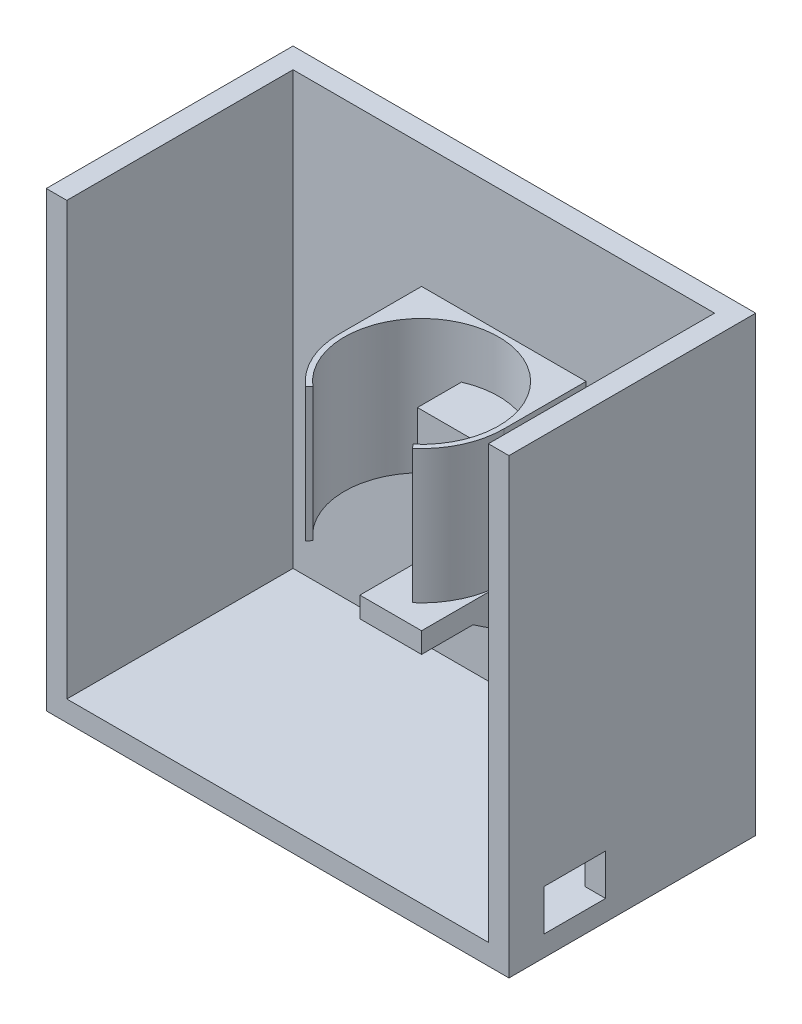
ISO-10303-21;
HEADER;
FILE_DESCRIPTION(('STEP AP214'),'2;1');
FILE_NAME('part.step','',(''),(''),'','','');
FILE_SCHEMA(('AUTOMOTIVE_DESIGN { 1 0 10303 214 1 1 1 1 }'));
ENDSEC;
DATA;
#1=APPLICATION_CONTEXT('core data for automotive mechanical design processes');
#2=APPLICATION_PROTOCOL_DEFINITION('international standard','automotive_design',2000,#1);
#3=PRODUCT_CONTEXT('',#1,'mechanical');
#4=PRODUCT('Part','Part','',(#3));
#5=PRODUCT_RELATED_PRODUCT_CATEGORY('part','',(#4));
#6=PRODUCT_DEFINITION_FORMATION('','',#4);
#7=PRODUCT_DEFINITION_CONTEXT('part definition',#1,'design');
#8=PRODUCT_DEFINITION('design','',#6,#7);
#9=PRODUCT_DEFINITION_SHAPE('','',#8);
#10=(LENGTH_UNIT() NAMED_UNIT(*) SI_UNIT(.MILLI.,.METRE.));
#11=(NAMED_UNIT(*) PLANE_ANGLE_UNIT() SI_UNIT($,.RADIAN.));
#12=(NAMED_UNIT(*) SI_UNIT($,.STERADIAN.) SOLID_ANGLE_UNIT());
#13=UNCERTAINTY_MEASURE_WITH_UNIT(LENGTH_MEASURE(1.E-05),#10,'distance_accuracy_value','');
#14=(GEOMETRIC_REPRESENTATION_CONTEXT(3) GLOBAL_UNCERTAINTY_ASSIGNED_CONTEXT((#13)) GLOBAL_UNIT_ASSIGNED_CONTEXT((#10,
#11,#12)) REPRESENTATION_CONTEXT('',''));
#15=CARTESIAN_POINT('',(0.,0.,0.));
#16=DIRECTION('',(0.,0.,1.));
#17=DIRECTION('',(1.,0.,0.));
#18=AXIS2_PLACEMENT_3D('',#15,#16,#17);
#19=CARTESIAN_POINT('',(0.,95.,50.));
#20=DIRECTION('',(0.,1.,0.));
#21=DIRECTION('',(0.,0.,1.));
#22=AXIS2_PLACEMENT_3D('',#19,#20,#21);
#23=CYLINDRICAL_SURFACE('',#22,37.5);
#24=CARTESIAN_POINT('',(0.,95.,50.));
#25=DIRECTION('',(0.,-1.,0.));
#26=DIRECTION('',(0.,0.,1.));
#27=AXIS2_PLACEMENT_3D('',#24,#25,#26);
#28=CIRCLE('',#27,37.5);
#29=CARTESIAN_POINT('',(-24.375,95.,78.497532787945));
#30=VERTEX_POINT('',#29);
#31=CARTESIAN_POINT('',(-15.,95.,15.6306822878312));
#32=VERTEX_POINT('',#31);
#33=EDGE_CURVE('E328',#30,#32,#28,.T.);
#34=ORIENTED_EDGE('',*,*,#33,.T.);
#35=DIRECTION('',(0.,-1.,0.));
#36=VECTOR('',#35,1.);
#37=CARTESIAN_POINT('',(-15.,135.,15.6306822878312));
#38=LINE('',#37,#36);
#39=CARTESIAN_POINT('',(-15.,135.,15.6306822878312));
#40=VERTEX_POINT('',#39);
#41=EDGE_CURVE('E324',#40,#32,#38,.T.);
#42=ORIENTED_EDGE('',*,*,#41,.F.);
#43=CARTESIAN_POINT('',(0.,135.,50.));
#44=DIRECTION('',(0.,1.,0.));
#45=DIRECTION('',(0.,0.,-1.));
#46=AXIS2_PLACEMENT_3D('',#43,#44,#45);
#47=CIRCLE('',#46,37.5);
#48=CARTESIAN_POINT('',(35.1745646739231,135.,37.));
#49=VERTEX_POINT('',#48);
#50=EDGE_CURVE('E306',#49,#40,#47,.T.);
#51=ORIENTED_EDGE('',*,*,#50,.F.);
#52=DIRECTION('',(0.,-1.,0.));
#53=VECTOR('',#52,1.);
#54=CARTESIAN_POINT('',(35.1745646739231,135.,37.));
#55=LINE('',#54,#53);
#56=CARTESIAN_POINT('',(35.1745646739231,95.,37.));
#57=VERTEX_POINT('',#56);
#58=EDGE_CURVE('E315',#49,#57,#55,.T.);
#59=ORIENTED_EDGE('',*,*,#58,.T.);
#60=CARTESIAN_POINT('',(24.375,95.,78.497532787945));
#61=VERTEX_POINT('',#60);
#62=EDGE_CURVE('E331',#57,#61,#28,.T.);
#63=ORIENTED_EDGE('',*,*,#62,.T.);
#64=DIRECTION('',(0.,1.,0.));
#65=VECTOR('',#64,1.);
#66=CARTESIAN_POINT('',(24.375,95.,78.497532787945));
#67=LINE('',#66,#65);
#68=CARTESIAN_POINT('',(24.375,160.,78.497532787945));
#69=VERTEX_POINT('',#68);
#70=EDGE_CURVE('E352',#61,#69,#67,.T.);
#71=ORIENTED_EDGE('',*,*,#70,.T.);
#72=CARTESIAN_POINT('',(0.,160.,50.));
#73=DIRECTION('',(0.,-1.,0.));
#74=DIRECTION('',(0.,0.,1.));
#75=AXIS2_PLACEMENT_3D('',#72,#73,#74);
#76=CIRCLE('',#75,37.5);
#77=CARTESIAN_POINT('',(-24.375,160.,78.497532787945));
#78=VERTEX_POINT('',#77);
#79=EDGE_CURVE('E327',#78,#69,#76,.T.);
#80=ORIENTED_EDGE('',*,*,#79,.F.);
#81=DIRECTION('',(0.,1.,0.));
#82=VECTOR('',#81,1.);
#83=CARTESIAN_POINT('',(-24.375,95.,78.497532787945));
#84=LINE('',#83,#82);
#85=EDGE_CURVE('E375',#30,#78,#84,.T.);
#86=ORIENTED_EDGE('',*,*,#85,.F.);
#87=EDGE_LOOP('',(#34,#42,#51,#59,#63,#71,#80,#86));
#88=FACE_BOUND('',#87,.T.);
#89=ADVANCED_FACE('F33',(#88),#23,.F.);
#90=CARTESIAN_POINT('',(0.,0.,9.99999999999999));
#91=DIRECTION('',(0.,0.,-1.));
#92=DIRECTION('',(-1.,0.,0.));
#93=AXIS2_PLACEMENT_3D('',#90,#91,#92);
#94=PLANE('',#93);
#95=DIRECTION('',(1.,0.,0.));
#96=VECTOR('',#95,1.);
#97=CARTESIAN_POINT('',(83.5,21.5,9.99999999999999));
#98=LINE('',#97,#96);
#99=CARTESIAN_POINT('',(61.5,21.5,9.99999999999999));
#100=VERTEX_POINT('',#99);
#101=CARTESIAN_POINT('',(83.5,21.5,9.99999999999999));
#102=VERTEX_POINT('',#101);
#103=EDGE_CURVE('E261',#100,#102,#98,.T.);
#104=ORIENTED_EDGE('',*,*,#103,.F.);
#105=DIRECTION('',(0.,-1.,0.));
#106=VECTOR('',#105,1.);
#107=CARTESIAN_POINT('',(61.5,21.5,9.99999999999999));
#108=LINE('',#107,#106);
#109=CARTESIAN_POINT('',(61.5,38.5,9.99999999999999));
#110=VERTEX_POINT('',#109);
#111=EDGE_CURVE('E243',#110,#100,#108,.T.);
#112=ORIENTED_EDGE('',*,*,#111,.F.);
#113=DIRECTION('',(-1.,0.,0.));
#114=VECTOR('',#113,1.);
#115=CARTESIAN_POINT('',(83.5,38.5,9.99999999999999));
#116=LINE('',#115,#114);
#117=CARTESIAN_POINT('',(83.5,38.5,9.99999999999999));
#118=VERTEX_POINT('',#117);
#119=EDGE_CURVE('E252',#118,#110,#116,.T.);
#120=ORIENTED_EDGE('',*,*,#119,.F.);
#121=DIRECTION('',(0.,1.,0.));
#122=VECTOR('',#121,1.);
#123=CARTESIAN_POINT('',(83.5,21.5,9.99999999999999));
#124=LINE('',#123,#122);
#125=EDGE_CURVE('E48',#102,#118,#124,.T.);
#126=ORIENTED_EDGE('',*,*,#125,.F.);
#127=EDGE_LOOP('',(#104,#112,#120,#126));
#128=FACE_BOUND('',#127,.T.);
#129=DIRECTION('',(-1.,0.,0.));
#130=VECTOR('',#129,1.);
#131=CARTESIAN_POINT('',(-102.5,220.,9.99999999999999));
#132=LINE('',#131,#130);
#133=CARTESIAN_POINT('',(102.5,220.,9.99999999999999));
#134=VERTEX_POINT('',#133);
#135=CARTESIAN_POINT('',(-102.5,220.,9.99999999999999));
#136=VERTEX_POINT('',#135);
#137=EDGE_CURVE('E431',#134,#136,#132,.T.);
#138=ORIENTED_EDGE('',*,*,#137,.T.);
#139=DIRECTION('',(0.,-1.,0.));
#140=VECTOR('',#139,1.);
#141=CARTESIAN_POINT('',(-102.5,10.,9.99999999999999));
#142=LINE('',#141,#140);
#143=CARTESIAN_POINT('',(-102.5,10.,9.99999999999999));
#144=VERTEX_POINT('',#143);
#145=EDGE_CURVE('E434',#136,#144,#142,.T.);
#146=ORIENTED_EDGE('',*,*,#145,.T.);
#147=DIRECTION('',(1.,0.,0.));
#148=VECTOR('',#147,1.);
#149=CARTESIAN_POINT('',(-102.5,10.,9.99999999999999));
#150=LINE('',#149,#148);
#151=CARTESIAN_POINT('',(102.5,10.,9.99999999999999));
#152=VERTEX_POINT('',#151);
#153=EDGE_CURVE('E437',#144,#152,#150,.T.);
#154=ORIENTED_EDGE('',*,*,#153,.T.);
#155=DIRECTION('',(0.,1.,0.));
#156=VECTOR('',#155,1.);
#157=CARTESIAN_POINT('',(102.5,10.,9.99999999999999));
#158=LINE('',#157,#156);
#159=EDGE_CURVE('E428',#152,#134,#158,.T.);
#160=ORIENTED_EDGE('',*,*,#159,.T.);
#161=EDGE_LOOP('',(#138,#146,#154,#160));
#162=FACE_BOUND('',#161,.T.);
#163=DIRECTION('',(-1.,0.,0.));
#164=VECTOR('',#163,1.);
#165=CARTESIAN_POINT('',(-15.,70.,9.99999999999999));
#166=LINE('',#165,#164);
#167=CARTESIAN_POINT('',(15.,70.,9.99999999999999));
#168=VERTEX_POINT('',#167);
#169=CARTESIAN_POINT('',(-15.,70.,9.99999999999999));
#170=VERTEX_POINT('',#169);
#171=EDGE_CURVE('E415',#168,#170,#166,.T.);
#172=ORIENTED_EDGE('',*,*,#171,.F.);
#173=DIRECTION('',(0.,1.,0.));
#174=VECTOR('',#173,1.);
#175=CARTESIAN_POINT('',(15.,60.,9.99999999999999));
#176=LINE('',#175,#174);
#177=CARTESIAN_POINT('',(15.,40.,9.99999999999999));
#178=VERTEX_POINT('',#177);
#179=EDGE_CURVE('E401',#178,#168,#176,.T.);
#180=ORIENTED_EDGE('',*,*,#179,.F.);
#181=DIRECTION('',(-1.,0.,0.));
#182=VECTOR('',#181,1.);
#183=CARTESIAN_POINT('',(0.,40.,9.99999999999999));
#184=LINE('',#183,#182);
#185=CARTESIAN_POINT('',(-15.,40.,9.99999999999999));
#186=VERTEX_POINT('',#185);
#187=EDGE_CURVE('E396',#178,#186,#184,.T.);
#188=ORIENTED_EDGE('',*,*,#187,.T.);
#189=DIRECTION('',(0.,-1.,0.));
#190=VECTOR('',#189,1.);
#191=CARTESIAN_POINT('',(-15.,60.,9.99999999999999));
#192=LINE('',#191,#190);
#193=EDGE_CURVE('E406',#170,#186,#192,.T.);
#194=ORIENTED_EDGE('',*,*,#193,.F.);
#195=EDGE_LOOP('',(#172,#180,#188,#194));
#196=FACE_BOUND('',#195,.T.);
#197=DIRECTION('',(-1.,0.,0.));
#198=VECTOR('',#197,1.);
#199=CARTESIAN_POINT('',(0.,95.,9.99999999999999));
#200=LINE('',#199,#198);
#201=CARTESIAN_POINT('',(40.,95.,9.99999999999999));
#202=VERTEX_POINT('',#201);
#203=CARTESIAN_POINT('',(-40.,95.,9.99999999999999));
#204=VERTEX_POINT('',#203);
#205=EDGE_CURVE('E340',#202,#204,#200,.T.);
#206=ORIENTED_EDGE('',*,*,#205,.T.);
#207=DIRECTION('',(0.,1.,0.));
#208=VECTOR('',#207,1.);
#209=CARTESIAN_POINT('',(-40.,95.,9.99999999999999));
#210=LINE('',#209,#208);
#211=CARTESIAN_POINT('',(-40.,160.,9.99999999999999));
#212=VERTEX_POINT('',#211);
#213=EDGE_CURVE('E382',#204,#212,#210,.T.);
#214=ORIENTED_EDGE('',*,*,#213,.T.);
#215=DIRECTION('',(-1.,0.,0.));
#216=VECTOR('',#215,1.);
#217=CARTESIAN_POINT('',(-40.,160.,9.99999999999999));
#218=LINE('',#217,#216);
#219=CARTESIAN_POINT('',(40.,160.,9.99999999999999));
#220=VERTEX_POINT('',#219);
#221=EDGE_CURVE('E363',#220,#212,#218,.T.);
#222=ORIENTED_EDGE('',*,*,#221,.F.);
#223=DIRECTION('',(0.,1.,0.));
#224=VECTOR('',#223,1.);
#225=CARTESIAN_POINT('',(40.,95.,9.99999999999999));
#226=LINE('',#225,#224);
#227=EDGE_CURVE('E385',#202,#220,#226,.T.);
#228=ORIENTED_EDGE('',*,*,#227,.F.);
#229=EDGE_LOOP('',(#206,#214,#222,#228));
#230=FACE_BOUND('',#229,.T.);
#231=ADVANCED_FACE('F258',(#128,#162,#196,#230),#94,.F.);
#232=CARTESIAN_POINT('',(112.5,0.,120.));
#233=DIRECTION('',(-1.,0.,0.));
#234=DIRECTION('',(0.,-1.,0.));
#235=AXIS2_PLACEMENT_3D('',#232,#233,#234);
#236=PLANE('',#235);
#237=DIRECTION('',(0.,0.,-1.));
#238=VECTOR('',#237,1.);
#239=CARTESIAN_POINT('',(112.5,10.,73.));
#240=LINE('',#239,#238);
#241=CARTESIAN_POINT('',(112.5,10.,103.));
#242=VERTEX_POINT('',#241);
#243=CARTESIAN_POINT('',(112.5,10.,73.));
#244=VERTEX_POINT('',#243);
#245=EDGE_CURVE('E279',#242,#244,#240,.T.);
#246=ORIENTED_EDGE('',*,*,#245,.F.);
#247=DIRECTION('',(0.,-1.,0.));
#248=VECTOR('',#247,1.);
#249=CARTESIAN_POINT('',(112.5,10.,103.));
#250=LINE('',#249,#248);
#251=CARTESIAN_POINT('',(112.5,30.,103.));
#252=VERTEX_POINT('',#251);
#253=EDGE_CURVE('E282',#252,#242,#250,.T.);
#254=ORIENTED_EDGE('',*,*,#253,.F.);
#255=DIRECTION('',(0.,0.,1.));
#256=VECTOR('',#255,1.);
#257=CARTESIAN_POINT('',(112.5,30.,73.));
#258=LINE('',#257,#256);
#259=CARTESIAN_POINT('',(112.5,30.,73.));
#260=VERTEX_POINT('',#259);
#261=EDGE_CURVE('E296',#260,#252,#258,.T.);
#262=ORIENTED_EDGE('',*,*,#261,.F.);
#263=DIRECTION('',(0.,1.,0.));
#264=VECTOR('',#263,1.);
#265=CARTESIAN_POINT('',(112.5,10.,73.));
#266=LINE('',#265,#264);
#267=EDGE_CURVE('E255',#244,#260,#266,.T.);
#268=ORIENTED_EDGE('',*,*,#267,.F.);
#269=EDGE_LOOP('',(#246,#254,#262,#268));
#270=FACE_BOUND('',#269,.T.);
#271=DIRECTION('',(0.,1.,0.));
#272=VECTOR('',#271,1.);
#273=CARTESIAN_POINT('',(112.5,0.,0.));
#274=LINE('',#273,#272);
#275=CARTESIAN_POINT('',(112.5,0.,0.));
#276=VERTEX_POINT('',#275);
#277=CARTESIAN_POINT('',(112.5,220.,0.));
#278=VERTEX_POINT('',#277);
#279=EDGE_CURVE('E450',#276,#278,#274,.T.);
#280=ORIENTED_EDGE('',*,*,#279,.T.);
#281=DIRECTION('',(0.,0.,-1.));
#282=VECTOR('',#281,1.);
#283=CARTESIAN_POINT('',(112.5,220.,120.));
#284=LINE('',#283,#282);
#285=CARTESIAN_POINT('',(112.5,220.,120.));
#286=VERTEX_POINT('',#285);
#287=EDGE_CURVE('E41',#286,#278,#284,.T.);
#288=ORIENTED_EDGE('',*,*,#287,.F.);
#289=DIRECTION('',(0.,1.,0.));
#290=VECTOR('',#289,1.);
#291=CARTESIAN_POINT('',(112.5,0.,120.));
#292=LINE('',#291,#290);
#293=CARTESIAN_POINT('',(112.5,0.,120.));
#294=VERTEX_POINT('',#293);
#295=EDGE_CURVE('E458',#294,#286,#292,.T.);
#296=ORIENTED_EDGE('',*,*,#295,.F.);
#297=DIRECTION('',(0.,0.,-1.));
#298=VECTOR('',#297,1.);
#299=CARTESIAN_POINT('',(112.5,0.,120.));
#300=LINE('',#299,#298);
#301=EDGE_CURVE('E470',#294,#276,#300,.T.);
#302=ORIENTED_EDGE('',*,*,#301,.T.);
#303=EDGE_LOOP('',(#280,#288,#296,#302));
#304=FACE_BOUND('',#303,.T.);
#305=ADVANCED_FACE('F35',(#270,#304),#236,.F.);
#306=CARTESIAN_POINT('',(-112.5,220.,120.));
#307=DIRECTION('',(0.,-1.,0.));
#308=DIRECTION('',(0.,0.,-1.));
#309=AXIS2_PLACEMENT_3D('',#306,#307,#308);
#310=PLANE('',#309);
#311=DIRECTION('',(-1.,0.,0.));
#312=VECTOR('',#311,1.);
#313=CARTESIAN_POINT('',(-112.5,220.,0.));
#314=LINE('',#313,#312);
#315=CARTESIAN_POINT('',(-112.5,220.,0.));
#316=VERTEX_POINT('',#315);
#317=EDGE_CURVE('E473',#278,#316,#314,.T.);
#318=ORIENTED_EDGE('',*,*,#317,.T.);
#319=DIRECTION('',(0.,0.,-1.));
#320=VECTOR('',#319,1.);
#321=CARTESIAN_POINT('',(-112.5,220.,120.));
#322=LINE('',#321,#320);
#323=CARTESIAN_POINT('',(-112.5,220.,120.));
#324=VERTEX_POINT('',#323);
#325=EDGE_CURVE('E483',#324,#316,#322,.T.);
#326=ORIENTED_EDGE('',*,*,#325,.F.);
#327=DIRECTION('',(-1.,0.,0.));
#328=VECTOR('',#327,1.);
#329=CARTESIAN_POINT('',(-112.5,220.,120.));
#330=LINE('',#329,#328);
#331=CARTESIAN_POINT('',(-102.5,220.,120.));
#332=VERTEX_POINT('',#331);
#333=EDGE_CURVE('E461',#332,#324,#330,.T.);
#334=ORIENTED_EDGE('',*,*,#333,.F.);
#335=DIRECTION('',(0.,0.,1.));
#336=VECTOR('',#335,1.);
#337=CARTESIAN_POINT('',(-102.5,220.,9.99999999999999));
#338=LINE('',#337,#336);
#339=EDGE_CURVE('E454',#136,#332,#338,.T.);
#340=ORIENTED_EDGE('',*,*,#339,.F.);
#341=ORIENTED_EDGE('',*,*,#137,.F.);
#342=DIRECTION('',(0.,0.,1.));
#343=VECTOR('',#342,1.);
#344=CARTESIAN_POINT('',(102.5,220.,9.99999999999999));
#345=LINE('',#344,#343);
#346=CARTESIAN_POINT('',(102.5,220.,120.));
#347=VERTEX_POINT('',#346);
#348=EDGE_CURVE('E440',#134,#347,#345,.T.);
#349=ORIENTED_EDGE('',*,*,#348,.T.);
#350=EDGE_CURVE('E463',#286,#347,#330,.T.);
#351=ORIENTED_EDGE('',*,*,#350,.F.);
#352=ORIENTED_EDGE('',*,*,#287,.T.);
#353=EDGE_LOOP('',(#318,#326,#334,#340,#341,#349,#351,#352));
#354=FACE_BOUND('',#353,.T.);
#355=ADVANCED_FACE('F488',(#354),#310,.F.);
#356=CARTESIAN_POINT('',(-112.5,0.,120.));
#357=DIRECTION('',(1.,0.,0.));
#358=DIRECTION('',(0.,1.,0.));
#359=AXIS2_PLACEMENT_3D('',#356,#357,#358);
#360=PLANE('',#359);
#361=DIRECTION('',(0.,-1.,0.));
#362=VECTOR('',#361,1.);
#363=CARTESIAN_POINT('',(-112.5,0.,0.));
#364=LINE('',#363,#362);
#365=CARTESIAN_POINT('',(-112.5,0.,0.));
#366=VERTEX_POINT('',#365);
#367=EDGE_CURVE('E475',#316,#366,#364,.T.);
#368=ORIENTED_EDGE('',*,*,#367,.T.);
#369=DIRECTION('',(0.,0.,-1.));
#370=VECTOR('',#369,1.);
#371=CARTESIAN_POINT('',(-112.5,0.,120.));
#372=LINE('',#371,#370);
#373=CARTESIAN_POINT('',(-112.5,0.,120.));
#374=VERTEX_POINT('',#373);
#375=EDGE_CURVE('E480',#374,#366,#372,.T.);
#376=ORIENTED_EDGE('',*,*,#375,.F.);
#377=DIRECTION('',(0.,-1.,0.));
#378=VECTOR('',#377,1.);
#379=CARTESIAN_POINT('',(-112.5,0.,120.));
#380=LINE('',#379,#378);
#381=EDGE_CURVE('E466',#324,#374,#380,.T.);
#382=ORIENTED_EDGE('',*,*,#381,.F.);
#383=ORIENTED_EDGE('',*,*,#325,.T.);
#384=EDGE_LOOP('',(#368,#376,#382,#383));
#385=FACE_BOUND('',#384,.T.);
#386=ADVANCED_FACE('F500',(#385),#360,.F.);
#387=CARTESIAN_POINT('',(-112.5,0.,120.));
#388=DIRECTION('',(0.,1.,0.));
#389=DIRECTION('',(0.,0.,1.));
#390=AXIS2_PLACEMENT_3D('',#387,#388,#389);
#391=PLANE('',#390);
#392=DIRECTION('',(1.,0.,0.));
#393=VECTOR('',#392,1.);
#394=CARTESIAN_POINT('',(-112.5,0.,0.));
#395=LINE('',#394,#393);
#396=EDGE_CURVE('E462',#366,#276,#395,.T.);
#397=ORIENTED_EDGE('',*,*,#396,.T.);
#398=ORIENTED_EDGE('',*,*,#301,.F.);
#399=DIRECTION('',(1.,0.,0.));
#400=VECTOR('',#399,1.);
#401=CARTESIAN_POINT('',(-112.5,0.,120.));
#402=LINE('',#401,#400);
#403=EDGE_CURVE('E468',#374,#294,#402,.T.);
#404=ORIENTED_EDGE('',*,*,#403,.F.);
#405=ORIENTED_EDGE('',*,*,#375,.T.);
#406=EDGE_LOOP('',(#397,#398,#404,#405));
#407=FACE_BOUND('',#406,.T.);
#408=ADVANCED_FACE('F504',(#407),#391,.F.);
#409=CARTESIAN_POINT('',(0.,0.,120.));
#410=DIRECTION('',(0.,0.,-1.));
#411=DIRECTION('',(-1.,0.,0.));
#412=AXIS2_PLACEMENT_3D('',#409,#410,#411);
#413=PLANE('',#412);
#414=ORIENTED_EDGE('',*,*,#350,.T.);
#415=DIRECTION('',(0.,1.,0.));
#416=VECTOR('',#415,1.);
#417=CARTESIAN_POINT('',(102.5,10.,120.));
#418=LINE('',#417,#416);
#419=CARTESIAN_POINT('',(102.5,10.,120.));
#420=VERTEX_POINT('',#419);
#421=EDGE_CURVE('E427',#420,#347,#418,.T.);
#422=ORIENTED_EDGE('',*,*,#421,.F.);
#423=DIRECTION('',(1.,0.,0.));
#424=VECTOR('',#423,1.);
#425=CARTESIAN_POINT('',(-102.5,10.,120.));
#426=LINE('',#425,#424);
#427=CARTESIAN_POINT('',(-102.5,10.,120.));
#428=VERTEX_POINT('',#427);
#429=EDGE_CURVE('E432',#428,#420,#426,.T.);
#430=ORIENTED_EDGE('',*,*,#429,.F.);
#431=DIRECTION('',(0.,-1.,0.));
#432=VECTOR('',#431,1.);
#433=CARTESIAN_POINT('',(-102.5,10.,120.));
#434=LINE('',#433,#432);
#435=EDGE_CURVE('E442',#332,#428,#434,.T.);
#436=ORIENTED_EDGE('',*,*,#435,.F.);
#437=ORIENTED_EDGE('',*,*,#333,.T.);
#438=ORIENTED_EDGE('',*,*,#381,.T.);
#439=ORIENTED_EDGE('',*,*,#403,.T.);
#440=ORIENTED_EDGE('',*,*,#295,.T.);
#441=EDGE_LOOP('',(#414,#422,#430,#436,#437,#438,#439,#440));
#442=FACE_BOUND('',#441,.T.);
#443=ADVANCED_FACE('F506',(#442),#413,.F.);
#444=CARTESIAN_POINT('',(0.,0.,0.));
#445=DIRECTION('',(0.,0.,-1.));
#446=DIRECTION('',(-1.,0.,0.));
#447=AXIS2_PLACEMENT_3D('',#444,#445,#446);
#448=PLANE('',#447);
#449=DIRECTION('',(0.,1.,0.));
#450=VECTOR('',#449,1.);
#451=CARTESIAN_POINT('',(61.5,21.5,0.));
#452=LINE('',#451,#450);
#453=CARTESIAN_POINT('',(61.5,21.5,0.));
#454=VERTEX_POINT('',#453);
#455=CARTESIAN_POINT('',(61.5,38.5,0.));
#456=VERTEX_POINT('',#455);
#457=EDGE_CURVE('E56',#454,#456,#452,.T.);
#458=ORIENTED_EDGE('',*,*,#457,.F.);
#459=DIRECTION('',(-1.,0.,0.));
#460=VECTOR('',#459,1.);
#461=CARTESIAN_POINT('',(83.5,21.5,0.));
#462=LINE('',#461,#460);
#463=CARTESIAN_POINT('',(83.5,21.5,0.));
#464=VERTEX_POINT('',#463);
#465=EDGE_CURVE('E249',#464,#454,#462,.T.);
#466=ORIENTED_EDGE('',*,*,#465,.F.);
#467=DIRECTION('',(0.,-1.,0.));
#468=VECTOR('',#467,1.);
#469=CARTESIAN_POINT('',(83.5,21.5,0.));
#470=LINE('',#469,#468);
#471=CARTESIAN_POINT('',(83.5,38.5,0.));
#472=VERTEX_POINT('',#471);
#473=EDGE_CURVE('E269',#472,#464,#470,.T.);
#474=ORIENTED_EDGE('',*,*,#473,.F.);
#475=DIRECTION('',(1.,0.,0.));
#476=VECTOR('',#475,1.);
#477=CARTESIAN_POINT('',(83.5,38.5,0.));
#478=LINE('',#477,#476);
#479=EDGE_CURVE('E263',#456,#472,#478,.T.);
#480=ORIENTED_EDGE('',*,*,#479,.F.);
#481=EDGE_LOOP('',(#458,#466,#474,#480));
#482=FACE_BOUND('',#481,.T.);
#483=ORIENTED_EDGE('',*,*,#367,.F.);
#484=ORIENTED_EDGE('',*,*,#317,.F.);
#485=ORIENTED_EDGE('',*,*,#279,.F.);
#486=ORIENTED_EDGE('',*,*,#396,.F.);
#487=EDGE_LOOP('',(#483,#484,#485,#486));
#488=FACE_BOUND('',#487,.T.);
#489=ADVANCED_FACE('F497',(#482,#488),#448,.T.);
#490=CARTESIAN_POINT('',(102.5,10.,9.99999999999999));
#491=DIRECTION('',(1.,0.,0.));
#492=DIRECTION('',(0.,1.,0.));
#493=AXIS2_PLACEMENT_3D('',#490,#491,#492);
#494=PLANE('',#493);
#495=DIRECTION('',(0.,0.,-1.));
#496=VECTOR('',#495,1.);
#497=CARTESIAN_POINT('',(102.5,30.,73.));
#498=LINE('',#497,#496);
#499=CARTESIAN_POINT('',(102.5,30.,103.));
#500=VERTEX_POINT('',#499);
#501=CARTESIAN_POINT('',(102.5,30.,73.));
#502=VERTEX_POINT('',#501);
#503=EDGE_CURVE('E288',#500,#502,#498,.T.);
#504=ORIENTED_EDGE('',*,*,#503,.F.);
#505=DIRECTION('',(0.,1.,0.));
#506=VECTOR('',#505,1.);
#507=CARTESIAN_POINT('',(102.5,10.,103.));
#508=LINE('',#507,#506);
#509=CARTESIAN_POINT('',(102.5,10.,103.));
#510=VERTEX_POINT('',#509);
#511=EDGE_CURVE('E285',#510,#500,#508,.T.);
#512=ORIENTED_EDGE('',*,*,#511,.F.);
#513=DIRECTION('',(0.,0.,1.));
#514=VECTOR('',#513,1.);
#515=CARTESIAN_POINT('',(102.5,10.,9.99999999999999));
#516=LINE('',#515,#514);
#517=EDGE_CURVE('E451',#510,#420,#516,.T.);
#518=ORIENTED_EDGE('',*,*,#517,.T.);
#519=ORIENTED_EDGE('',*,*,#421,.T.);
#520=ORIENTED_EDGE('',*,*,#348,.F.);
#521=ORIENTED_EDGE('',*,*,#159,.F.);
#522=CARTESIAN_POINT('',(102.5,10.,73.));
#523=VERTEX_POINT('',#522);
#524=EDGE_CURVE('E447',#152,#523,#516,.T.);
#525=ORIENTED_EDGE('',*,*,#524,.T.);
#526=DIRECTION('',(0.,-1.,0.));
#527=VECTOR('',#526,1.);
#528=CARTESIAN_POINT('',(102.5,10.,73.));
#529=LINE('',#528,#527);
#530=EDGE_CURVE('E291',#502,#523,#529,.T.);
#531=ORIENTED_EDGE('',*,*,#530,.F.);
#532=EDGE_LOOP('',(#504,#512,#518,#519,#520,#521,#525,#531));
#533=FACE_BOUND('',#532,.T.);
#534=ADVANCED_FACE('F523',(#533),#494,.F.);
#535=CARTESIAN_POINT('',(-102.5,10.,9.99999999999999));
#536=DIRECTION('',(0.,-1.,0.));
#537=DIRECTION('',(1.,0.,0.));
#538=AXIS2_PLACEMENT_3D('',#535,#536,#537);
#539=PLANE('',#538);
#540=ORIENTED_EDGE('',*,*,#429,.T.);
#541=ORIENTED_EDGE('',*,*,#517,.F.);
#542=DIRECTION('',(-1.,0.,0.));
#543=VECTOR('',#542,1.);
#544=CARTESIAN_POINT('',(112.501,10.,103.));
#545=LINE('',#544,#543);
#546=EDGE_CURVE('E294',#242,#510,#545,.T.);
#547=ORIENTED_EDGE('',*,*,#546,.F.);
#548=ORIENTED_EDGE('',*,*,#245,.T.);
#549=DIRECTION('',(-1.,0.,0.));
#550=VECTOR('',#549,1.);
#551=CARTESIAN_POINT('',(112.501,10.,73.));
#552=LINE('',#551,#550);
#553=EDGE_CURVE('E297',#244,#523,#552,.T.);
#554=ORIENTED_EDGE('',*,*,#553,.T.);
#555=ORIENTED_EDGE('',*,*,#524,.F.);
#556=ORIENTED_EDGE('',*,*,#153,.F.);
#557=DIRECTION('',(0.,0.,1.));
#558=VECTOR('',#557,1.);
#559=CARTESIAN_POINT('',(-102.5,10.,9.99999999999999));
#560=LINE('',#559,#558);
#561=EDGE_CURVE('E452',#144,#428,#560,.T.);
#562=ORIENTED_EDGE('',*,*,#561,.T.);
#563=EDGE_LOOP('',(#540,#541,#547,#548,#554,#555,#556,#562));
#564=FACE_BOUND('',#563,.T.);
#565=ADVANCED_FACE('F518',(#564),#539,.F.);
#566=CARTESIAN_POINT('',(-102.5,10.,9.99999999999999));
#567=DIRECTION('',(-1.,0.,0.));
#568=DIRECTION('',(0.,0.,1.));
#569=AXIS2_PLACEMENT_3D('',#566,#567,#568);
#570=PLANE('',#569);
#571=ORIENTED_EDGE('',*,*,#435,.T.);
#572=ORIENTED_EDGE('',*,*,#561,.F.);
#573=ORIENTED_EDGE('',*,*,#145,.F.);
#574=ORIENTED_EDGE('',*,*,#339,.T.);
#575=EDGE_LOOP('',(#571,#572,#573,#574));
#576=FACE_BOUND('',#575,.T.);
#577=ADVANCED_FACE('F514',(#576),#570,.F.);
#578=CARTESIAN_POINT('',(15.,60.,65.));
#579=DIRECTION('',(-1.,0.,0.));
#580=DIRECTION('',(0.,0.,1.));
#581=AXIS2_PLACEMENT_3D('',#578,#579,#580);
#582=PLANE('',#581);
#583=ORIENTED_EDGE('',*,*,#179,.T.);
#584=DIRECTION('',(0.,0.,-1.));
#585=VECTOR('',#584,1.);
#586=CARTESIAN_POINT('',(15.,70.,65.));
#587=LINE('',#586,#585);
#588=CARTESIAN_POINT('',(15.,70.,65.));
#589=VERTEX_POINT('',#588);
#590=EDGE_CURVE('E425',#589,#168,#587,.T.);
#591=ORIENTED_EDGE('',*,*,#590,.F.);
#592=DIRECTION('',(0.,1.,0.));
#593=VECTOR('',#592,1.);
#594=CARTESIAN_POINT('',(15.,60.,65.));
#595=LINE('',#594,#593);
#596=CARTESIAN_POINT('',(15.,60.,65.));
#597=VERTEX_POINT('',#596);
#598=EDGE_CURVE('E402',#597,#589,#595,.T.);
#599=ORIENTED_EDGE('',*,*,#598,.F.);
#600=DIRECTION('',(0.,0.,-1.));
#601=VECTOR('',#600,1.);
#602=CARTESIAN_POINT('',(15.,60.,65.));
#603=LINE('',#602,#601);
#604=CARTESIAN_POINT('',(15.,60.,40.));
#605=VERTEX_POINT('',#604);
#606=EDGE_CURVE('E412',#597,#605,#603,.T.);
#607=ORIENTED_EDGE('',*,*,#606,.T.);
#608=DIRECTION('',(0.,-0.554700196225229,-0.832050294337843));
#609=VECTOR('',#608,1.);
#610=CARTESIAN_POINT('',(15.,60.,40.));
#611=LINE('',#610,#609);
#612=EDGE_CURVE('E393',#605,#178,#611,.T.);
#613=ORIENTED_EDGE('',*,*,#612,.T.);
#614=EDGE_LOOP('',(#583,#591,#599,#607,#613));
#615=FACE_BOUND('',#614,.T.);
#616=ADVANCED_FACE('F580',(#615),#582,.F.);
#617=CARTESIAN_POINT('',(-15.,70.,65.));
#618=DIRECTION('',(0.,-1.,0.));
#619=DIRECTION('',(0.,0.,-1.));
#620=AXIS2_PLACEMENT_3D('',#617,#618,#619);
#621=PLANE('',#620);
#622=ORIENTED_EDGE('',*,*,#590,.T.);
#623=ORIENTED_EDGE('',*,*,#171,.T.);
#624=DIRECTION('',(0.,0.,-1.));
#625=VECTOR('',#624,1.);
#626=CARTESIAN_POINT('',(-15.,70.,65.));
#627=LINE('',#626,#625);
#628=CARTESIAN_POINT('',(-15.,70.,65.));
#629=VERTEX_POINT('',#628);
#630=EDGE_CURVE('E423',#629,#170,#627,.T.);
#631=ORIENTED_EDGE('',*,*,#630,.F.);
#632=DIRECTION('',(-1.,0.,0.));
#633=VECTOR('',#632,1.);
#634=CARTESIAN_POINT('',(-15.,70.,65.));
#635=LINE('',#634,#633);
#636=EDGE_CURVE('E405',#589,#629,#635,.T.);
#637=ORIENTED_EDGE('',*,*,#636,.F.);
#638=EDGE_LOOP('',(#622,#623,#631,#637));
#639=FACE_BOUND('',#638,.T.);
#640=ADVANCED_FACE('F576',(#639),#621,.F.);
#641=CARTESIAN_POINT('',(-15.,60.,65.));
#642=DIRECTION('',(1.,0.,0.));
#643=DIRECTION('',(0.,0.,-1.));
#644=AXIS2_PLACEMENT_3D('',#641,#642,#643);
#645=PLANE('',#644);
#646=ORIENTED_EDGE('',*,*,#630,.T.);
#647=ORIENTED_EDGE('',*,*,#193,.T.);
#648=DIRECTION('',(0.,-0.554700196225229,-0.832050294337843));
#649=VECTOR('',#648,1.);
#650=CARTESIAN_POINT('',(-15.,60.,40.));
#651=LINE('',#650,#649);
#652=CARTESIAN_POINT('',(-15.,60.,40.));
#653=VERTEX_POINT('',#652);
#654=EDGE_CURVE('E377',#653,#186,#651,.T.);
#655=ORIENTED_EDGE('',*,*,#654,.F.);
#656=DIRECTION('',(0.,0.,-1.));
#657=VECTOR('',#656,1.);
#658=CARTESIAN_POINT('',(-15.,60.,65.));
#659=LINE('',#658,#657);
#660=CARTESIAN_POINT('',(-15.,60.,65.));
#661=VERTEX_POINT('',#660);
#662=EDGE_CURVE('E421',#661,#653,#659,.T.);
#663=ORIENTED_EDGE('',*,*,#662,.F.);
#664=DIRECTION('',(0.,-1.,0.));
#665=VECTOR('',#664,1.);
#666=CARTESIAN_POINT('',(-15.,60.,65.));
#667=LINE('',#666,#665);
#668=EDGE_CURVE('E408',#629,#661,#667,.T.);
#669=ORIENTED_EDGE('',*,*,#668,.F.);
#670=EDGE_LOOP('',(#646,#647,#655,#663,#669));
#671=FACE_BOUND('',#670,.T.);
#672=ADVANCED_FACE('F572',(#671),#645,.F.);
#673=CARTESIAN_POINT('',(-15.,60.,65.));
#674=DIRECTION('',(0.,1.,0.));
#675=DIRECTION('',(0.,0.,1.));
#676=AXIS2_PLACEMENT_3D('',#673,#674,#675);
#677=PLANE('',#676);
#678=ORIENTED_EDGE('',*,*,#662,.T.);
#679=DIRECTION('',(1.,0.,0.));
#680=VECTOR('',#679,1.);
#681=CARTESIAN_POINT('',(-15.,60.,40.));
#682=LINE('',#681,#680);
#683=EDGE_CURVE('E11',#653,#605,#682,.T.);
#684=ORIENTED_EDGE('',*,*,#683,.T.);
#685=ORIENTED_EDGE('',*,*,#606,.F.);
#686=DIRECTION('',(1.,0.,0.));
#687=VECTOR('',#686,1.);
#688=CARTESIAN_POINT('',(-15.,60.,65.));
#689=LINE('',#688,#687);
#690=EDGE_CURVE('E410',#661,#597,#689,.T.);
#691=ORIENTED_EDGE('',*,*,#690,.F.);
#692=EDGE_LOOP('',(#678,#684,#685,#691));
#693=FACE_BOUND('',#692,.T.);
#694=ADVANCED_FACE('F568',(#693),#677,.F.);
#695=CARTESIAN_POINT('',(0.,0.,65.));
#696=DIRECTION('',(0.,0.,-1.));
#697=DIRECTION('',(-1.,0.,0.));
#698=AXIS2_PLACEMENT_3D('',#695,#696,#697);
#699=PLANE('',#698);
#700=ORIENTED_EDGE('',*,*,#598,.T.);
#701=ORIENTED_EDGE('',*,*,#636,.T.);
#702=ORIENTED_EDGE('',*,*,#668,.T.);
#703=ORIENTED_EDGE('',*,*,#690,.T.);
#704=EDGE_LOOP('',(#700,#701,#702,#703));
#705=FACE_BOUND('',#704,.T.);
#706=ADVANCED_FACE('F564',(#705),#699,.F.);
#707=CARTESIAN_POINT('',(0.,60.,40.));
#708=DIRECTION('',(0.,-0.832050294337844,0.554700196225229));
#709=DIRECTION('',(0.,-0.554700196225229,-0.832050294337843));
#710=AXIS2_PLACEMENT_3D('',#707,#708,#709);
#711=PLANE('',#710);
#712=ORIENTED_EDGE('',*,*,#187,.F.);
#713=ORIENTED_EDGE('',*,*,#612,.F.);
#714=ORIENTED_EDGE('',*,*,#683,.F.);
#715=ORIENTED_EDGE('',*,*,#654,.T.);
#716=EDGE_LOOP('',(#712,#713,#714,#715));
#717=FACE_BOUND('',#716,.T.);
#718=ADVANCED_FACE('F560',(#717),#711,.T.);
#719=CARTESIAN_POINT('',(-24.375,95.,78.497532787945));
#720=DIRECTION('',(0.759934207678533,0.,0.650000000000001));
#721=DIRECTION('',(0.650000000000001,0.,-0.759934207678533));
#722=AXIS2_PLACEMENT_3D('',#719,#720,#721);
#723=PLANE('',#722);
#724=DIRECTION('',(0.650000000000001,0.,-0.759934207678533));
#725=VECTOR('',#724,1.);
#726=CARTESIAN_POINT('',(-24.375,160.,78.497532787945));
#727=LINE('',#726,#725);
#728=CARTESIAN_POINT('',(-26.,160.,80.3973683071413));
#729=VERTEX_POINT('',#728);
#730=EDGE_CURVE('E372',#729,#78,#727,.T.);
#731=ORIENTED_EDGE('',*,*,#730,.F.);
#732=DIRECTION('',(0.,1.,0.));
#733=VECTOR('',#732,1.);
#734=CARTESIAN_POINT('',(-26.,95.,80.3973683071413));
#735=LINE('',#734,#733);
#736=CARTESIAN_POINT('',(-26.,95.,80.3973683071413));
#737=VERTEX_POINT('',#736);
#738=EDGE_CURVE('E378',#737,#729,#735,.T.);
#739=ORIENTED_EDGE('',*,*,#738,.F.);
#740=DIRECTION('',(0.650000000000001,0.,-0.759934207678533));
#741=VECTOR('',#740,1.);
#742=CARTESIAN_POINT('',(-24.375,95.,78.497532787945));
#743=LINE('',#742,#741);
#744=EDGE_CURVE('E349',#737,#30,#743,.T.);
#745=ORIENTED_EDGE('',*,*,#744,.T.);
#746=ORIENTED_EDGE('',*,*,#85,.T.);
#747=EDGE_LOOP('',(#731,#739,#745,#746));
#748=FACE_BOUND('',#747,.T.);
#749=ADVANCED_FACE('F563',(#748),#723,.T.);
#750=CARTESIAN_POINT('',(0.,95.,50.));
#751=DIRECTION('',(0.,1.,0.));
#752=DIRECTION('',(0.,0.,1.));
#753=AXIS2_PLACEMENT_3D('',#750,#751,#752);
#754=CYLINDRICAL_SURFACE('',#753,40.);
#755=CARTESIAN_POINT('',(0.,160.,50.));
#756=DIRECTION('',(0.,1.,0.));
#757=DIRECTION('',(0.,0.,1.));
#758=AXIS2_PLACEMENT_3D('',#755,#756,#757);
#759=CIRCLE('',#758,40.);
#760=CARTESIAN_POINT('',(-40.,160.,50.));
#761=VERTEX_POINT('',#760);
#762=EDGE_CURVE('E369',#761,#729,#759,.T.);
#763=ORIENTED_EDGE('',*,*,#762,.F.);
#764=DIRECTION('',(0.,1.,0.));
#765=VECTOR('',#764,1.);
#766=CARTESIAN_POINT('',(-40.,95.,50.));
#767=LINE('',#766,#765);
#768=CARTESIAN_POINT('',(-40.,95.,50.));
#769=VERTEX_POINT('',#768);
#770=EDGE_CURVE('E380',#769,#761,#767,.T.);
#771=ORIENTED_EDGE('',*,*,#770,.F.);
#772=CARTESIAN_POINT('',(0.,95.,50.));
#773=DIRECTION('',(0.,1.,0.));
#774=DIRECTION('',(0.,0.,1.));
#775=AXIS2_PLACEMENT_3D('',#772,#773,#774);
#776=CIRCLE('',#775,40.);
#777=EDGE_CURVE('E346',#769,#737,#776,.T.);
#778=ORIENTED_EDGE('',*,*,#777,.T.);
#779=ORIENTED_EDGE('',*,*,#738,.T.);
#780=EDGE_LOOP('',(#763,#771,#778,#779));
#781=FACE_BOUND('',#780,.T.);
#782=ADVANCED_FACE('F769',(#781),#754,.T.);
#783=CARTESIAN_POINT('',(-40.,95.,50.));
#784=DIRECTION('',(-1.,0.,0.));
#785=DIRECTION('',(0.,0.,1.));
#786=AXIS2_PLACEMENT_3D('',#783,#784,#785);
#787=PLANE('',#786);
#788=DIRECTION('',(0.,0.,1.));
#789=VECTOR('',#788,1.);
#790=CARTESIAN_POINT('',(-40.,160.,50.));
#791=LINE('',#790,#789);
#792=EDGE_CURVE('E366',#212,#761,#791,.T.);
#793=ORIENTED_EDGE('',*,*,#792,.F.);
#794=ORIENTED_EDGE('',*,*,#213,.F.);
#795=DIRECTION('',(0.,0.,1.));
#796=VECTOR('',#795,1.);
#797=CARTESIAN_POINT('',(-40.,95.,50.));
#798=LINE('',#797,#796);
#799=EDGE_CURVE('E343',#204,#769,#798,.T.);
#800=ORIENTED_EDGE('',*,*,#799,.T.);
#801=ORIENTED_EDGE('',*,*,#770,.T.);
#802=EDGE_LOOP('',(#793,#794,#800,#801));
#803=FACE_BOUND('',#802,.T.);
#804=ADVANCED_FACE('F761',(#803),#787,.T.);
#805=CARTESIAN_POINT('',(40.,95.,9.99999999999999));
#806=DIRECTION('',(1.,0.,0.));
#807=DIRECTION('',(0.,0.,-1.));
#808=AXIS2_PLACEMENT_3D('',#805,#806,#807);
#809=PLANE('',#808);
#810=DIRECTION('',(0.,0.,-1.));
#811=VECTOR('',#810,1.);
#812=CARTESIAN_POINT('',(40.,160.,9.99999999999999));
#813=LINE('',#812,#811);
#814=CARTESIAN_POINT('',(40.,160.,50.));
#815=VERTEX_POINT('',#814);
#816=EDGE_CURVE('E361',#815,#220,#813,.T.);
#817=ORIENTED_EDGE('',*,*,#816,.F.);
#818=DIRECTION('',(0.,1.,0.));
#819=VECTOR('',#818,1.);
#820=CARTESIAN_POINT('',(40.,95.,50.));
#821=LINE('',#820,#819);
#822=CARTESIAN_POINT('',(40.,95.,50.));
#823=VERTEX_POINT('',#822);
#824=EDGE_CURVE('E388',#823,#815,#821,.T.);
#825=ORIENTED_EDGE('',*,*,#824,.F.);
#826=DIRECTION('',(0.,0.,-1.));
#827=VECTOR('',#826,1.);
#828=CARTESIAN_POINT('',(40.,95.,9.99999999999999));
#829=LINE('',#828,#827);
#830=EDGE_CURVE('E337',#823,#202,#829,.T.);
#831=ORIENTED_EDGE('',*,*,#830,.T.);
#832=ORIENTED_EDGE('',*,*,#227,.T.);
#833=EDGE_LOOP('',(#817,#825,#831,#832));
#834=FACE_BOUND('',#833,.T.);
#835=ADVANCED_FACE('F754',(#834),#809,.T.);
#836=CARTESIAN_POINT('',(0.,95.,50.));
#837=DIRECTION('',(0.,1.,0.));
#838=DIRECTION('',(0.,0.,1.));
#839=AXIS2_PLACEMENT_3D('',#836,#837,#838);
#840=CYLINDRICAL_SURFACE('',#839,40.);
#841=CARTESIAN_POINT('',(0.,160.,50.));
#842=DIRECTION('',(0.,1.,0.));
#843=DIRECTION('',(0.,0.,1.));
#844=AXIS2_PLACEMENT_3D('',#841,#842,#843);
#845=CIRCLE('',#844,40.);
#846=CARTESIAN_POINT('',(26.,160.,80.3973683071413));
#847=VERTEX_POINT('',#846);
#848=EDGE_CURVE('E358',#847,#815,#845,.T.);
#849=ORIENTED_EDGE('',*,*,#848,.F.);
#850=DIRECTION('',(0.,1.,0.));
#851=VECTOR('',#850,1.);
#852=CARTESIAN_POINT('',(26.,95.,80.3973683071413));
#853=LINE('',#852,#851);
#854=CARTESIAN_POINT('',(26.,95.,80.3973683071413));
#855=VERTEX_POINT('',#854);
#856=EDGE_CURVE('E390',#855,#847,#853,.T.);
#857=ORIENTED_EDGE('',*,*,#856,.F.);
#858=CARTESIAN_POINT('',(0.,95.,50.));
#859=DIRECTION('',(0.,1.,0.));
#860=DIRECTION('',(0.,0.,1.));
#861=AXIS2_PLACEMENT_3D('',#858,#859,#860);
#862=CIRCLE('',#861,40.);
#863=EDGE_CURVE('E334',#855,#823,#862,.T.);
#864=ORIENTED_EDGE('',*,*,#863,.T.);
#865=ORIENTED_EDGE('',*,*,#824,.T.);
#866=EDGE_LOOP('',(#849,#857,#864,#865));
#867=FACE_BOUND('',#866,.T.);
#868=ADVANCED_FACE('F748',(#867),#840,.T.);
#869=CARTESIAN_POINT('',(24.375,95.,78.497532787945));
#870=DIRECTION('',(-0.759934207678529,0.,0.650000000000005));
#871=DIRECTION('',(0.650000000000005,0.,0.759934207678529));
#872=AXIS2_PLACEMENT_3D('',#869,#870,#871);
#873=PLANE('',#872);
#874=DIRECTION('',(0.650000000000005,0.,0.759934207678529));
#875=VECTOR('',#874,1.);
#876=CARTESIAN_POINT('',(24.375,160.,78.497532787945));
#877=LINE('',#876,#875);
#878=EDGE_CURVE('E355',#69,#847,#877,.T.);
#879=ORIENTED_EDGE('',*,*,#878,.F.);
#880=ORIENTED_EDGE('',*,*,#70,.F.);
#881=DIRECTION('',(0.650000000000005,0.,0.759934207678529));
#882=VECTOR('',#881,1.);
#883=CARTESIAN_POINT('',(24.375,95.,78.497532787945));
#884=LINE('',#883,#882);
#885=EDGE_CURVE('E330',#61,#855,#884,.T.);
#886=ORIENTED_EDGE('',*,*,#885,.T.);
#887=ORIENTED_EDGE('',*,*,#856,.T.);
#888=EDGE_LOOP('',(#879,#880,#886,#887));
#889=FACE_BOUND('',#888,.T.);
#890=ADVANCED_FACE('F558',(#889),#873,.T.);
#891=CARTESIAN_POINT('',(0.,95.,50.));
#892=DIRECTION('',(0.,1.,0.));
#893=DIRECTION('',(0.,0.,1.));
#894=AXIS2_PLACEMENT_3D('',#891,#892,#893);
#895=PLANE('',#894);
#896=ORIENTED_EDGE('',*,*,#33,.F.);
#897=ORIENTED_EDGE('',*,*,#744,.F.);
#898=ORIENTED_EDGE('',*,*,#777,.F.);
#899=ORIENTED_EDGE('',*,*,#799,.F.);
#900=ORIENTED_EDGE('',*,*,#205,.F.);
#901=ORIENTED_EDGE('',*,*,#830,.F.);
#902=ORIENTED_EDGE('',*,*,#863,.F.);
#903=ORIENTED_EDGE('',*,*,#885,.F.);
#904=ORIENTED_EDGE('',*,*,#62,.F.);
#905=DIRECTION('',(1.,0.,0.));
#906=VECTOR('',#905,1.);
#907=CARTESIAN_POINT('',(-15.,95.,37.));
#908=LINE('',#907,#906);
#909=CARTESIAN_POINT('',(-15.,95.,37.));
#910=VERTEX_POINT('',#909);
#911=EDGE_CURVE('E310',#910,#57,#908,.T.);
#912=ORIENTED_EDGE('',*,*,#911,.F.);
#913=DIRECTION('',(0.,0.,1.));
#914=VECTOR('',#913,1.);
#915=CARTESIAN_POINT('',(-15.,95.,15.6306822878312));
#916=LINE('',#915,#914);
#917=EDGE_CURVE('E305',#32,#910,#916,.T.);
#918=ORIENTED_EDGE('',*,*,#917,.F.);
#919=EDGE_LOOP('',(#896,#897,#898,#899,#900,#901,#902,#903,#904,#912,#918));
#920=FACE_BOUND('',#919,.T.);
#921=ADVANCED_FACE('F712',(#920),#895,.F.);
#922=CARTESIAN_POINT('',(0.,160.,50.));
#923=DIRECTION('',(0.,1.,0.));
#924=DIRECTION('',(0.,0.,1.));
#925=AXIS2_PLACEMENT_3D('',#922,#923,#924);
#926=PLANE('',#925);
#927=ORIENTED_EDGE('',*,*,#79,.T.);
#928=ORIENTED_EDGE('',*,*,#878,.T.);
#929=ORIENTED_EDGE('',*,*,#848,.T.);
#930=ORIENTED_EDGE('',*,*,#816,.T.);
#931=ORIENTED_EDGE('',*,*,#221,.T.);
#932=ORIENTED_EDGE('',*,*,#792,.T.);
#933=ORIENTED_EDGE('',*,*,#762,.T.);
#934=ORIENTED_EDGE('',*,*,#730,.T.);
#935=EDGE_LOOP('',(#927,#928,#929,#930,#931,#932,#933,#934));
#936=FACE_BOUND('',#935,.T.);
#937=ADVANCED_FACE('F707',(#936),#926,.T.);
#938=CARTESIAN_POINT('',(-15.,135.,15.6306822878312));
#939=DIRECTION('',(1.,0.,0.));
#940=DIRECTION('',(0.,0.,-1.));
#941=AXIS2_PLACEMENT_3D('',#938,#939,#940);
#942=PLANE('',#941);
#943=ORIENTED_EDGE('',*,*,#917,.T.);
#944=DIRECTION('',(0.,-1.,0.));
#945=VECTOR('',#944,1.);
#946=CARTESIAN_POINT('',(-15.,135.,37.));
#947=LINE('',#946,#945);
#948=CARTESIAN_POINT('',(-15.,135.,37.));
#949=VERTEX_POINT('',#948);
#950=EDGE_CURVE('E321',#949,#910,#947,.T.);
#951=ORIENTED_EDGE('',*,*,#950,.F.);
#952=DIRECTION('',(0.,0.,1.));
#953=VECTOR('',#952,1.);
#954=CARTESIAN_POINT('',(-15.,135.,15.6306822878312));
#955=LINE('',#954,#953);
#956=EDGE_CURVE('E309',#40,#949,#955,.T.);
#957=ORIENTED_EDGE('',*,*,#956,.F.);
#958=ORIENTED_EDGE('',*,*,#41,.T.);
#959=EDGE_LOOP('',(#943,#951,#957,#958));
#960=FACE_BOUND('',#959,.T.);
#961=ADVANCED_FACE('F698',(#960),#942,.F.);
#962=CARTESIAN_POINT('',(-15.,135.,37.));
#963=DIRECTION('',(0.,0.,-1.));
#964=DIRECTION('',(-1.,0.,0.));
#965=AXIS2_PLACEMENT_3D('',#962,#963,#964);
#966=PLANE('',#965);
#967=ORIENTED_EDGE('',*,*,#911,.T.);
#968=ORIENTED_EDGE('',*,*,#58,.F.);
#969=DIRECTION('',(1.,0.,0.));
#970=VECTOR('',#969,1.);
#971=CARTESIAN_POINT('',(-15.,135.,37.));
#972=LINE('',#971,#970);
#973=EDGE_CURVE('E312',#949,#49,#972,.T.);
#974=ORIENTED_EDGE('',*,*,#973,.F.);
#975=ORIENTED_EDGE('',*,*,#950,.T.);
#976=EDGE_LOOP('',(#967,#968,#974,#975));
#977=FACE_BOUND('',#976,.T.);
#978=ADVANCED_FACE('F689',(#977),#966,.F.);
#979=CARTESIAN_POINT('',(0.,135.,50.));
#980=DIRECTION('',(0.,-1.,0.));
#981=DIRECTION('',(0.,0.,-1.));
#982=AXIS2_PLACEMENT_3D('',#979,#980,#981);
#983=PLANE('',#982);
#984=ORIENTED_EDGE('',*,*,#50,.T.);
#985=ORIENTED_EDGE('',*,*,#956,.T.);
#986=ORIENTED_EDGE('',*,*,#973,.T.);
#987=EDGE_LOOP('',(#984,#985,#986));
#988=FACE_BOUND('',#987,.T.);
#989=ADVANCED_FACE('F674',(#988),#983,.F.);
#990=CARTESIAN_POINT('',(112.501,10.,103.));
#991=DIRECTION('',(0.,0.,1.));
#992=DIRECTION('',(0.,-1.,0.));
#993=AXIS2_PLACEMENT_3D('',#990,#991,#992);
#994=PLANE('',#993);
#995=ORIENTED_EDGE('',*,*,#253,.T.);
#996=ORIENTED_EDGE('',*,*,#546,.T.);
#997=ORIENTED_EDGE('',*,*,#511,.T.);
#998=DIRECTION('',(-1.,0.,0.));
#999=VECTOR('',#998,1.);
#1000=CARTESIAN_POINT('',(112.501,30.,103.));
#1001=LINE('',#1000,#999);
#1002=EDGE_CURVE('E293',#252,#500,#1001,.T.);
#1003=ORIENTED_EDGE('',*,*,#1002,.F.);
#1004=EDGE_LOOP('',(#995,#996,#997,#1003));
#1005=FACE_BOUND('',#1004,.T.);
#1006=ADVANCED_FACE('F528',(#1005),#994,.F.);
#1007=CARTESIAN_POINT('',(112.501,10.,73.));
#1008=DIRECTION('',(0.,0.,-1.));
#1009=DIRECTION('',(0.,1.,0.));
#1010=AXIS2_PLACEMENT_3D('',#1007,#1008,#1009);
#1011=PLANE('',#1010);
#1012=ORIENTED_EDGE('',*,*,#267,.T.);
#1013=DIRECTION('',(-1.,0.,0.));
#1014=VECTOR('',#1013,1.);
#1015=CARTESIAN_POINT('',(112.501,30.,73.));
#1016=LINE('',#1015,#1014);
#1017=EDGE_CURVE('E300',#260,#502,#1016,.T.);
#1018=ORIENTED_EDGE('',*,*,#1017,.T.);
#1019=ORIENTED_EDGE('',*,*,#530,.T.);
#1020=ORIENTED_EDGE('',*,*,#553,.F.);
#1021=EDGE_LOOP('',(#1012,#1018,#1019,#1020));
#1022=FACE_BOUND('',#1021,.T.);
#1023=ADVANCED_FACE('F536',(#1022),#1011,.F.);
#1024=CARTESIAN_POINT('',(112.501,30.,73.));
#1025=DIRECTION('',(0.,1.,0.));
#1026=DIRECTION('',(-1.,0.,0.));
#1027=AXIS2_PLACEMENT_3D('',#1024,#1025,#1026);
#1028=PLANE('',#1027);
#1029=ORIENTED_EDGE('',*,*,#261,.T.);
#1030=ORIENTED_EDGE('',*,*,#1002,.T.);
#1031=ORIENTED_EDGE('',*,*,#503,.T.);
#1032=ORIENTED_EDGE('',*,*,#1017,.F.);
#1033=EDGE_LOOP('',(#1029,#1030,#1031,#1032));
#1034=FACE_BOUND('',#1033,.T.);
#1035=ADVANCED_FACE('F538',(#1034),#1028,.F.);
#1036=CARTESIAN_POINT('',(61.5,21.5,120.001));
#1037=DIRECTION('',(-1.,0.,0.));
#1038=DIRECTION('',(0.,0.,1.));
#1039=AXIS2_PLACEMENT_3D('',#1036,#1037,#1038);
#1040=PLANE('',#1039);
#1041=ORIENTED_EDGE('',*,*,#111,.T.);
#1042=DIRECTION('',(0.,0.,-1.));
#1043=VECTOR('',#1042,1.);
#1044=CARTESIAN_POINT('',(61.5,21.5,120.001));
#1045=LINE('',#1044,#1043);
#1046=EDGE_CURVE('E256',#100,#454,#1045,.T.);
#1047=ORIENTED_EDGE('',*,*,#1046,.T.);
#1048=ORIENTED_EDGE('',*,*,#457,.T.);
#1049=DIRECTION('',(0.,0.,-1.));
#1050=VECTOR('',#1049,1.);
#1051=CARTESIAN_POINT('',(61.5,38.5,120.001));
#1052=LINE('',#1051,#1050);
#1053=EDGE_CURVE('E239',#110,#456,#1052,.T.);
#1054=ORIENTED_EDGE('',*,*,#1053,.F.);
#1055=EDGE_LOOP('',(#1041,#1047,#1048,#1054));
#1056=FACE_BOUND('',#1055,.T.);
#1057=ADVANCED_FACE('F241',(#1056),#1040,.F.);
#1058=CARTESIAN_POINT('',(83.5,21.5,120.001));
#1059=DIRECTION('',(0.,-1.,0.));
#1060=DIRECTION('',(0.,0.,-1.));
#1061=AXIS2_PLACEMENT_3D('',#1058,#1059,#1060);
#1062=PLANE('',#1061);
#1063=ORIENTED_EDGE('',*,*,#103,.T.);
#1064=DIRECTION('',(0.,0.,-1.));
#1065=VECTOR('',#1064,1.);
#1066=CARTESIAN_POINT('',(83.5,21.5,120.001));
#1067=LINE('',#1066,#1065);
#1068=EDGE_CURVE('E275',#102,#464,#1067,.T.);
#1069=ORIENTED_EDGE('',*,*,#1068,.T.);
#1070=ORIENTED_EDGE('',*,*,#465,.T.);
#1071=ORIENTED_EDGE('',*,*,#1046,.F.);
#1072=EDGE_LOOP('',(#1063,#1069,#1070,#1071));
#1073=FACE_BOUND('',#1072,.T.);
#1074=ADVANCED_FACE('F545',(#1073),#1062,.F.);
#1075=CARTESIAN_POINT('',(83.5,21.5,120.001));
#1076=DIRECTION('',(1.,0.,0.));
#1077=DIRECTION('',(0.,0.,-1.));
#1078=AXIS2_PLACEMENT_3D('',#1075,#1076,#1077);
#1079=PLANE('',#1078);
#1080=ORIENTED_EDGE('',*,*,#125,.T.);
#1081=DIRECTION('',(0.,0.,-1.));
#1082=VECTOR('',#1081,1.);
#1083=CARTESIAN_POINT('',(83.5,38.5,120.001));
#1084=LINE('',#1083,#1082);
#1085=EDGE_CURVE('E248',#118,#472,#1084,.T.);
#1086=ORIENTED_EDGE('',*,*,#1085,.T.);
#1087=ORIENTED_EDGE('',*,*,#473,.T.);
#1088=ORIENTED_EDGE('',*,*,#1068,.F.);
#1089=EDGE_LOOP('',(#1080,#1086,#1087,#1088));
#1090=FACE_BOUND('',#1089,.T.);
#1091=ADVANCED_FACE('F639',(#1090),#1079,.F.);
#1092=CARTESIAN_POINT('',(83.5,38.5,120.001));
#1093=DIRECTION('',(0.,1.,0.));
#1094=DIRECTION('',(0.,0.,1.));
#1095=AXIS2_PLACEMENT_3D('',#1092,#1093,#1094);
#1096=PLANE('',#1095);
#1097=ORIENTED_EDGE('',*,*,#119,.T.);
#1098=ORIENTED_EDGE('',*,*,#1053,.T.);
#1099=ORIENTED_EDGE('',*,*,#479,.T.);
#1100=ORIENTED_EDGE('',*,*,#1085,.F.);
#1101=EDGE_LOOP('',(#1097,#1098,#1099,#1100));
#1102=FACE_BOUND('',#1101,.T.);
#1103=ADVANCED_FACE('F253',(#1102),#1096,.F.);
#1104=CLOSED_SHELL('',(#89,#231,#305,#355,#386,#408,#443,#489,#534,#565,#577,#616,#640,#672,
#694,#706,#718,#749,#782,#804,#835,#868,#890,#921,#937,#961,#978,#989,#1006,#1023,#1035,#1057,
#1074,#1091,#1103));
#1105=MANIFOLD_SOLID_BREP('B2',#1104);
#1106=ADVANCED_BREP_SHAPE_REPRESENTATION('',(#18,#1105),#14);
#1107=SHAPE_DEFINITION_REPRESENTATION(#9,#1106);
ENDSEC;
END-ISO-10303-21;
